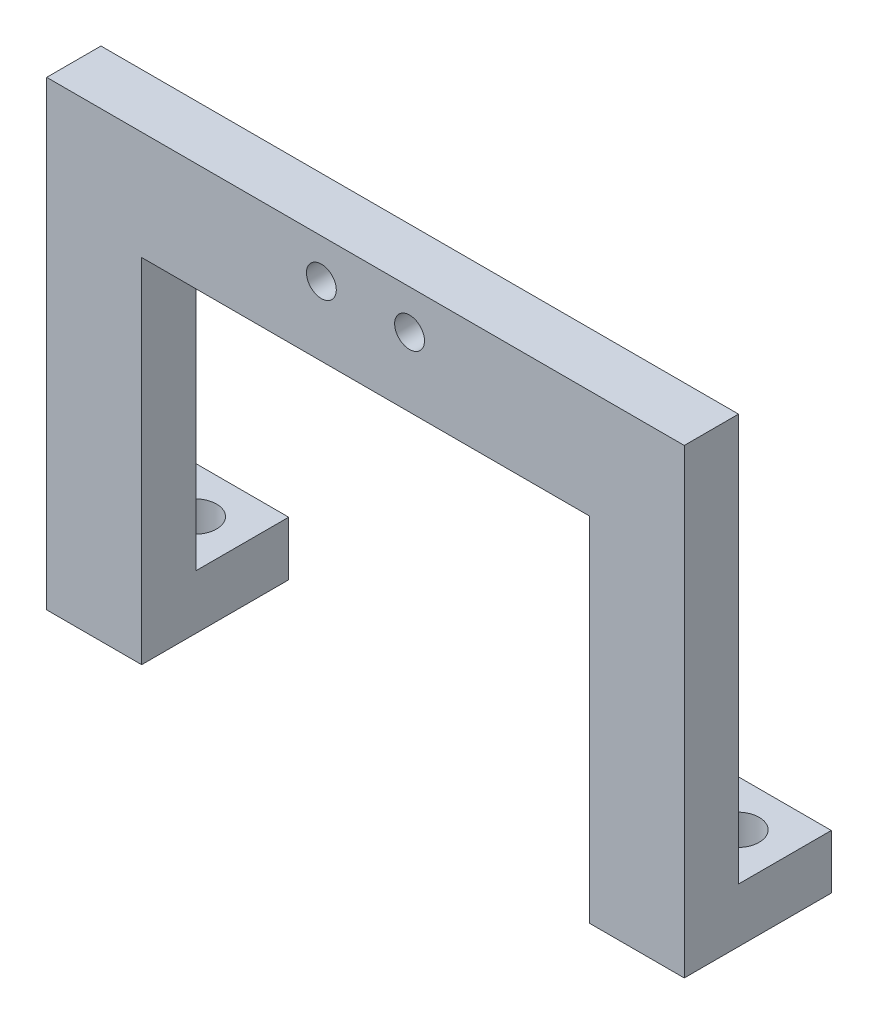
ISO-10303-21;
HEADER;
FILE_DESCRIPTION(('STEP AP214'),'2;1');
FILE_NAME('part.step','',(''),(''),'','','');
FILE_SCHEMA(('AUTOMOTIVE_DESIGN { 1 0 10303 214 1 1 1 1 }'));
ENDSEC;
DATA;
#1=APPLICATION_CONTEXT('core data for automotive mechanical design processes');
#2=APPLICATION_PROTOCOL_DEFINITION('international standard','automotive_design',2000,#1);
#3=PRODUCT_CONTEXT('',#1,'mechanical');
#4=PRODUCT('Part','Part','',(#3));
#5=PRODUCT_RELATED_PRODUCT_CATEGORY('part','',(#4));
#6=PRODUCT_DEFINITION_FORMATION('','',#4);
#7=PRODUCT_DEFINITION_CONTEXT('part definition',#1,'design');
#8=PRODUCT_DEFINITION('design','',#6,#7);
#9=PRODUCT_DEFINITION_SHAPE('','',#8);
#10=(LENGTH_UNIT() NAMED_UNIT(*) SI_UNIT(.MILLI.,.METRE.));
#11=(NAMED_UNIT(*) PLANE_ANGLE_UNIT() SI_UNIT($,.RADIAN.));
#12=(NAMED_UNIT(*) SI_UNIT($,.STERADIAN.) SOLID_ANGLE_UNIT());
#13=UNCERTAINTY_MEASURE_WITH_UNIT(LENGTH_MEASURE(1.E-05),#10,'distance_accuracy_value','');
#14=(GEOMETRIC_REPRESENTATION_CONTEXT(3) GLOBAL_UNCERTAINTY_ASSIGNED_CONTEXT((#13)) GLOBAL_UNIT_ASSIGNED_CONTEXT((#10,
#11,#12)) REPRESENTATION_CONTEXT('',''));
#15=CARTESIAN_POINT('',(0.,0.,0.));
#16=DIRECTION('',(0.,0.,1.));
#17=DIRECTION('',(1.,0.,0.));
#18=AXIS2_PLACEMENT_3D('',#15,#16,#17);
#19=CARTESIAN_POINT('',(23.5,26.,7.41991341991342));
#20=DIRECTION('',(0.,-1.,0.));
#21=DIRECTION('',(0.,0.,-1.));
#22=AXIS2_PLACEMENT_3D('',#19,#20,#21);
#23=PLANE('',#22);
#24=DIRECTION('',(-1.,0.,0.));
#25=VECTOR('',#24,1.);
#26=CARTESIAN_POINT('',(23.5,26.,3.41991341991342));
#27=LINE('',#26,#25);
#28=CARTESIAN_POINT('',(16.5,26.,3.41991341991342));
#29=VERTEX_POINT('',#28);
#30=CARTESIAN_POINT('',(-16.5,26.,3.41991341991342));
#31=VERTEX_POINT('',#30);
#32=EDGE_CURVE('E60',#29,#31,#27,.T.);
#33=ORIENTED_EDGE('',*,*,#32,.F.);
#34=DIRECTION('',(0.,0.,1.));
#35=VECTOR('',#34,1.);
#36=CARTESIAN_POINT('',(16.5,26.,7.41991341991342));
#37=LINE('',#36,#35);
#38=CARTESIAN_POINT('',(16.5,26.,7.41991341991342));
#39=VERTEX_POINT('',#38);
#40=EDGE_CURVE('E11',#29,#39,#37,.T.);
#41=ORIENTED_EDGE('',*,*,#40,.T.);
#42=DIRECTION('',(-1.,0.,0.));
#43=VECTOR('',#42,1.);
#44=CARTESIAN_POINT('',(23.5,26.,7.41991341991342));
#45=LINE('',#44,#43);
#46=CARTESIAN_POINT('',(-16.5,26.,7.41991341991342));
#47=VERTEX_POINT('',#46);
#48=EDGE_CURVE('E199',#39,#47,#45,.T.);
#49=ORIENTED_EDGE('',*,*,#48,.T.);
#50=DIRECTION('',(0.,0.,1.));
#51=VECTOR('',#50,1.);
#52=CARTESIAN_POINT('',(-16.5,26.,3.41991341991342));
#53=LINE('',#52,#51);
#54=EDGE_CURVE('E210',#31,#47,#53,.T.);
#55=ORIENTED_EDGE('',*,*,#54,.F.);
#56=EDGE_LOOP('',(#33,#41,#49,#55));
#57=FACE_BOUND('',#56,.T.);
#58=ADVANCED_FACE('F39',(#57),#23,.T.);
#59=CARTESIAN_POINT('',(0.,4.,0.));
#60=DIRECTION('',(0.,-1.,0.));
#61=DIRECTION('',(0.,0.,-1.));
#62=AXIS2_PLACEMENT_3D('',#59,#60,#61);
#63=PLANE('',#62);
#64=CARTESIAN_POINT('',(-20.,4.,0.));
#65=DIRECTION('',(0.,1.,0.));
#66=DIRECTION('',(0.,0.,1.));
#67=AXIS2_PLACEMENT_3D('',#64,#65,#66);
#68=CIRCLE('',#67,1.6);
#69=CARTESIAN_POINT('',(-20.,4.,1.6));
#70=VERTEX_POINT('',#69);
#71=EDGE_CURVE('E235',#70,#70,#68,.T.);
#72=ORIENTED_EDGE('',*,*,#71,.F.);
#73=EDGE_LOOP('',(#72));
#74=FACE_BOUND('',#73,.T.);
#75=DIRECTION('',(-1.,0.,0.));
#76=VECTOR('',#75,1.);
#77=CARTESIAN_POINT('',(-23.5,4.,3.41991341991342));
#78=LINE('',#77,#76);
#79=CARTESIAN_POINT('',(-16.5,4.,3.41991341991342));
#80=VERTEX_POINT('',#79);
#81=CARTESIAN_POINT('',(-23.5,4.,3.41991341991342));
#82=VERTEX_POINT('',#81);
#83=EDGE_CURVE('E214',#80,#82,#78,.T.);
#84=ORIENTED_EDGE('',*,*,#83,.F.);
#85=DIRECTION('',(0.,0.,-1.));
#86=VECTOR('',#85,1.);
#87=CARTESIAN_POINT('',(-16.5,4.,-3.41991341991342));
#88=LINE('',#87,#86);
#89=CARTESIAN_POINT('',(-16.5,4.,-3.41991341991342));
#90=VERTEX_POINT('',#89);
#91=EDGE_CURVE('E243',#80,#90,#88,.T.);
#92=ORIENTED_EDGE('',*,*,#91,.T.);
#93=DIRECTION('',(-1.,0.,0.));
#94=VECTOR('',#93,1.);
#95=CARTESIAN_POINT('',(-23.5,4.,-3.41991341991342));
#96=LINE('',#95,#94);
#97=CARTESIAN_POINT('',(-23.5,4.,-3.41991341991342));
#98=VERTEX_POINT('',#97);
#99=EDGE_CURVE('E246',#90,#98,#96,.T.);
#100=ORIENTED_EDGE('',*,*,#99,.T.);
#101=DIRECTION('',(0.,0.,1.));
#102=VECTOR('',#101,1.);
#103=CARTESIAN_POINT('',(-23.5,4.,3.41991341991342));
#104=LINE('',#103,#102);
#105=EDGE_CURVE('E250',#98,#82,#104,.T.);
#106=ORIENTED_EDGE('',*,*,#105,.T.);
#107=EDGE_LOOP('',(#84,#92,#100,#106));
#108=FACE_BOUND('',#107,.T.);
#109=ADVANCED_FACE('F301',(#74,#108),#63,.F.);
#110=CARTESIAN_POINT('',(0.,0.,0.));
#111=DIRECTION('',(0.,-1.,0.));
#112=DIRECTION('',(0.,0.,-1.));
#113=AXIS2_PLACEMENT_3D('',#110,#111,#112);
#114=PLANE('',#113);
#115=DIRECTION('',(-1.,0.,0.));
#116=VECTOR('',#115,1.);
#117=CARTESIAN_POINT('',(-23.5,0.,-3.41991341991342));
#118=LINE('',#117,#116);
#119=CARTESIAN_POINT('',(-16.5,0.,-3.41991341991342));
#120=VERTEX_POINT('',#119);
#121=CARTESIAN_POINT('',(-23.5,0.,-3.41991341991342));
#122=VERTEX_POINT('',#121);
#123=EDGE_CURVE('E239',#120,#122,#118,.T.);
#124=ORIENTED_EDGE('',*,*,#123,.F.);
#125=DIRECTION('',(0.,0.,-1.));
#126=VECTOR('',#125,1.);
#127=CARTESIAN_POINT('',(-16.5,0.,3.41991341991342));
#128=LINE('',#127,#126);
#129=CARTESIAN_POINT('',(-16.5,0.,7.41991341991342));
#130=VERTEX_POINT('',#129);
#131=EDGE_CURVE('E247',#130,#120,#128,.T.);
#132=ORIENTED_EDGE('',*,*,#131,.F.);
#133=DIRECTION('',(1.,0.,0.));
#134=VECTOR('',#133,1.);
#135=CARTESIAN_POINT('',(-16.5,0.,7.41991341991342));
#136=LINE('',#135,#134);
#137=CARTESIAN_POINT('',(-23.5,0.,7.41991341991342));
#138=VERTEX_POINT('',#137);
#139=EDGE_CURVE('E262',#138,#130,#136,.T.);
#140=ORIENTED_EDGE('',*,*,#139,.F.);
#141=DIRECTION('',(0.,0.,1.));
#142=VECTOR('',#141,1.);
#143=CARTESIAN_POINT('',(-23.5,0.,7.41991341991342));
#144=LINE('',#143,#142);
#145=EDGE_CURVE('E258',#122,#138,#144,.T.);
#146=ORIENTED_EDGE('',*,*,#145,.F.);
#147=EDGE_LOOP('',(#124,#132,#140,#146));
#148=FACE_BOUND('',#147,.T.);
#149=CARTESIAN_POINT('',(-20.,0.,0.));
#150=DIRECTION('',(0.,1.,0.));
#151=DIRECTION('',(0.,0.,1.));
#152=AXIS2_PLACEMENT_3D('',#149,#150,#151);
#153=CIRCLE('',#152,1.6);
#154=CARTESIAN_POINT('',(-20.,0.,1.6));
#155=VERTEX_POINT('',#154);
#156=EDGE_CURVE('E234',#155,#155,#153,.T.);
#157=ORIENTED_EDGE('',*,*,#156,.T.);
#158=EDGE_LOOP('',(#157));
#159=FACE_BOUND('',#158,.T.);
#160=ADVANCED_FACE('F291',(#148,#159),#114,.T.);
#161=CARTESIAN_POINT('',(-23.5,4.,-3.41991341991342));
#162=DIRECTION('',(0.,0.,1.));
#163=DIRECTION('',(1.,0.,0.));
#164=AXIS2_PLACEMENT_3D('',#161,#162,#163);
#165=PLANE('',#164);
#166=ORIENTED_EDGE('',*,*,#123,.T.);
#167=DIRECTION('',(0.,-1.,0.));
#168=VECTOR('',#167,1.);
#169=CARTESIAN_POINT('',(-23.5,4.,-3.41991341991342));
#170=LINE('',#169,#168);
#171=EDGE_CURVE('E273',#98,#122,#170,.T.);
#172=ORIENTED_EDGE('',*,*,#171,.F.);
#173=ORIENTED_EDGE('',*,*,#99,.F.);
#174=DIRECTION('',(0.,-1.,0.));
#175=VECTOR('',#174,1.);
#176=CARTESIAN_POINT('',(-16.5,4.,-3.41991341991342));
#177=LINE('',#176,#175);
#178=EDGE_CURVE('E48',#90,#120,#177,.T.);
#179=ORIENTED_EDGE('',*,*,#178,.T.);
#180=EDGE_LOOP('',(#166,#172,#173,#179));
#181=FACE_BOUND('',#180,.T.);
#182=ADVANCED_FACE('F41',(#181),#165,.F.);
#183=CARTESIAN_POINT('',(-23.5,4.,7.41991341991342));
#184=DIRECTION('',(1.,0.,0.));
#185=DIRECTION('',(0.,0.,-1.));
#186=AXIS2_PLACEMENT_3D('',#183,#184,#185);
#187=PLANE('',#186);
#188=ORIENTED_EDGE('',*,*,#145,.T.);
#189=DIRECTION('',(0.,-1.,0.));
#190=VECTOR('',#189,1.);
#191=CARTESIAN_POINT('',(-23.5,4.,7.41991341991342));
#192=LINE('',#191,#190);
#193=CARTESIAN_POINT('',(-23.5,34.,7.41991341991342));
#194=VERTEX_POINT('',#193);
#195=EDGE_CURVE('E270',#194,#138,#192,.T.);
#196=ORIENTED_EDGE('',*,*,#195,.F.);
#197=DIRECTION('',(0.,0.,1.));
#198=VECTOR('',#197,1.);
#199=CARTESIAN_POINT('',(-23.5,34.,3.41991341991342));
#200=LINE('',#199,#198);
#201=CARTESIAN_POINT('',(-23.5,34.,3.41991341991342));
#202=VERTEX_POINT('',#201);
#203=EDGE_CURVE('E215',#202,#194,#200,.T.);
#204=ORIENTED_EDGE('',*,*,#203,.F.);
#205=DIRECTION('',(0.,-1.,0.));
#206=VECTOR('',#205,1.);
#207=CARTESIAN_POINT('',(-23.5,34.,3.41991341991342));
#208=LINE('',#207,#206);
#209=EDGE_CURVE('E225',#202,#82,#208,.T.);
#210=ORIENTED_EDGE('',*,*,#209,.T.);
#211=ORIENTED_EDGE('',*,*,#105,.F.);
#212=ORIENTED_EDGE('',*,*,#171,.T.);
#213=EDGE_LOOP('',(#188,#196,#204,#210,#211,#212));
#214=FACE_BOUND('',#213,.T.);
#215=ADVANCED_FACE('F294',(#214),#187,.F.);
#216=CARTESIAN_POINT('',(-16.5,4.,7.41991341991342));
#217=DIRECTION('',(0.,0.,-1.));
#218=DIRECTION('',(-1.,0.,0.));
#219=AXIS2_PLACEMENT_3D('',#216,#217,#218);
#220=PLANE('',#219);
#221=CARTESIAN_POINT('',(3.25,31.1,7.41991341991342));
#222=DIRECTION('',(0.,0.,-1.));
#223=DIRECTION('',(-1.,0.,0.));
#224=AXIS2_PLACEMENT_3D('',#221,#222,#223);
#225=CIRCLE('',#224,1.1);
#226=CARTESIAN_POINT('',(2.15,31.1,7.41991341991342));
#227=VERTEX_POINT('',#226);
#228=EDGE_CURVE('E150',#227,#227,#225,.T.);
#229=ORIENTED_EDGE('',*,*,#228,.T.);
#230=EDGE_LOOP('',(#229));
#231=FACE_BOUND('',#230,.T.);
#232=CARTESIAN_POINT('',(-3.25,31.1,7.41991341991342));
#233=DIRECTION('',(0.,0.,-1.));
#234=DIRECTION('',(1.,0.,0.));
#235=AXIS2_PLACEMENT_3D('',#232,#233,#234);
#236=CIRCLE('',#235,1.1);
#237=CARTESIAN_POINT('',(-2.15,31.1,7.41991341991342));
#238=VERTEX_POINT('',#237);
#239=EDGE_CURVE('E484',#238,#238,#236,.T.);
#240=ORIENTED_EDGE('',*,*,#239,.T.);
#241=EDGE_LOOP('',(#240));
#242=FACE_BOUND('',#241,.T.);
#243=DIRECTION('',(0.,-1.,0.));
#244=VECTOR('',#243,1.);
#245=CARTESIAN_POINT('',(23.5,34.,7.41991341991342));
#246=LINE('',#245,#244);
#247=CARTESIAN_POINT('',(23.5,34.,7.41991341991342));
#248=VERTEX_POINT('',#247);
#249=CARTESIAN_POINT('',(23.5,0.,7.41991341991342));
#250=VERTEX_POINT('',#249);
#251=EDGE_CURVE('E196',#248,#250,#246,.T.);
#252=ORIENTED_EDGE('',*,*,#251,.F.);
#253=DIRECTION('',(1.,0.,0.));
#254=VECTOR('',#253,1.);
#255=CARTESIAN_POINT('',(-23.5,34.,7.41991341991342));
#256=LINE('',#255,#254);
#257=EDGE_CURVE('E219',#194,#248,#256,.T.);
#258=ORIENTED_EDGE('',*,*,#257,.F.);
#259=ORIENTED_EDGE('',*,*,#195,.T.);
#260=ORIENTED_EDGE('',*,*,#139,.T.);
#261=DIRECTION('',(0.,-1.,0.));
#262=VECTOR('',#261,1.);
#263=CARTESIAN_POINT('',(-16.5,4.,7.41991341991342));
#264=LINE('',#263,#262);
#265=EDGE_CURVE('E254',#47,#130,#264,.T.);
#266=ORIENTED_EDGE('',*,*,#265,.F.);
#267=ORIENTED_EDGE('',*,*,#48,.F.);
#268=DIRECTION('',(0.,-1.,0.));
#269=VECTOR('',#268,1.);
#270=CARTESIAN_POINT('',(16.5,4.,7.41991341991342));
#271=LINE('',#270,#269);
#272=CARTESIAN_POINT('',(16.5,0.,7.41991341991342));
#273=VERTEX_POINT('',#272);
#274=EDGE_CURVE('E144',#39,#273,#271,.T.);
#275=ORIENTED_EDGE('',*,*,#274,.T.);
#276=DIRECTION('',(1.,0.,0.));
#277=VECTOR('',#276,1.);
#278=CARTESIAN_POINT('',(16.5,0.,7.41991341991342));
#279=LINE('',#278,#277);
#280=EDGE_CURVE('E164',#273,#250,#279,.T.);
#281=ORIENTED_EDGE('',*,*,#280,.T.);
#282=EDGE_LOOP('',(#252,#258,#259,#260,#266,#267,#275,#281));
#283=FACE_BOUND('',#282,.T.);
#284=ADVANCED_FACE('F306',(#231,#242,#283),#220,.F.);
#285=CARTESIAN_POINT('',(-16.5,4.,3.41991341991342));
#286=DIRECTION('',(-1.,0.,0.));
#287=DIRECTION('',(0.,0.,1.));
#288=AXIS2_PLACEMENT_3D('',#285,#286,#287);
#289=PLANE('',#288);
#290=DIRECTION('',(0.,-1.,0.));
#291=VECTOR('',#290,1.);
#292=CARTESIAN_POINT('',(-16.5,34.,3.41991341991342));
#293=LINE('',#292,#291);
#294=EDGE_CURVE('E231',#31,#80,#293,.T.);
#295=ORIENTED_EDGE('',*,*,#294,.F.);
#296=ORIENTED_EDGE('',*,*,#54,.T.);
#297=ORIENTED_EDGE('',*,*,#265,.T.);
#298=ORIENTED_EDGE('',*,*,#131,.T.);
#299=ORIENTED_EDGE('',*,*,#178,.F.);
#300=ORIENTED_EDGE('',*,*,#91,.F.);
#301=EDGE_LOOP('',(#295,#296,#297,#298,#299,#300));
#302=FACE_BOUND('',#301,.T.);
#303=ADVANCED_FACE('F286',(#302),#289,.F.);
#304=CARTESIAN_POINT('',(-20.,4.,0.));
#305=DIRECTION('',(0.,-1.,0.));
#306=DIRECTION('',(0.,0.,-1.));
#307=AXIS2_PLACEMENT_3D('',#304,#305,#306);
#308=CYLINDRICAL_SURFACE('',#307,1.6);
#309=ORIENTED_EDGE('',*,*,#71,.T.);
#310=EDGE_LOOP('',(#309));
#311=FACE_BOUND('',#310,.T.);
#312=ORIENTED_EDGE('',*,*,#156,.F.);
#313=EDGE_LOOP('',(#312));
#314=FACE_BOUND('',#313,.T.);
#315=ADVANCED_FACE('F354',(#311,#314),#308,.F.);
#316=CARTESIAN_POINT('',(-23.5,34.,3.41991341991342));
#317=DIRECTION('',(0.,0.,1.));
#318=DIRECTION('',(1.,0.,0.));
#319=AXIS2_PLACEMENT_3D('',#316,#317,#318);
#320=PLANE('',#319);
#321=CARTESIAN_POINT('',(3.25,31.1,3.41991341991342));
#322=DIRECTION('',(0.,0.,-1.));
#323=DIRECTION('',(-1.,0.,0.));
#324=AXIS2_PLACEMENT_3D('',#321,#322,#323);
#325=CIRCLE('',#324,1.1);
#326=CARTESIAN_POINT('',(2.15,31.1,3.41991341991342));
#327=VERTEX_POINT('',#326);
#328=EDGE_CURVE('E154',#327,#327,#325,.T.);
#329=ORIENTED_EDGE('',*,*,#328,.F.);
#330=EDGE_LOOP('',(#329));
#331=FACE_BOUND('',#330,.T.);
#332=CARTESIAN_POINT('',(-3.25,31.1,3.41991341991342));
#333=DIRECTION('',(0.,0.,-1.));
#334=DIRECTION('',(1.,0.,0.));
#335=AXIS2_PLACEMENT_3D('',#332,#333,#334);
#336=CIRCLE('',#335,1.1);
#337=CARTESIAN_POINT('',(-2.15,31.1,3.41991341991342));
#338=VERTEX_POINT('',#337);
#339=EDGE_CURVE('E157',#338,#338,#336,.T.);
#340=ORIENTED_EDGE('',*,*,#339,.F.);
#341=EDGE_LOOP('',(#340));
#342=FACE_BOUND('',#341,.T.);
#343=DIRECTION('',(0.,-1.,0.));
#344=VECTOR('',#343,1.);
#345=CARTESIAN_POINT('',(23.5,34.,3.41991341991342));
#346=LINE('',#345,#344);
#347=CARTESIAN_POINT('',(23.5,34.,3.41991341991342));
#348=VERTEX_POINT('',#347);
#349=CARTESIAN_POINT('',(23.5,4.,3.41991341991342));
#350=VERTEX_POINT('',#349);
#351=EDGE_CURVE('E148',#348,#350,#346,.T.);
#352=ORIENTED_EDGE('',*,*,#351,.T.);
#353=DIRECTION('',(-1.,0.,0.));
#354=VECTOR('',#353,1.);
#355=CARTESIAN_POINT('',(16.5,4.,3.41991341991342));
#356=LINE('',#355,#354);
#357=CARTESIAN_POINT('',(16.5,4.,3.41991341991342));
#358=VERTEX_POINT('',#357);
#359=EDGE_CURVE('E133',#350,#358,#356,.T.);
#360=ORIENTED_EDGE('',*,*,#359,.T.);
#361=DIRECTION('',(0.,-1.,0.));
#362=VECTOR('',#361,1.);
#363=CARTESIAN_POINT('',(16.5,34.,3.41991341991342));
#364=LINE('',#363,#362);
#365=EDGE_CURVE('E55',#29,#358,#364,.T.);
#366=ORIENTED_EDGE('',*,*,#365,.F.);
#367=ORIENTED_EDGE('',*,*,#32,.T.);
#368=ORIENTED_EDGE('',*,*,#294,.T.);
#369=ORIENTED_EDGE('',*,*,#83,.T.);
#370=ORIENTED_EDGE('',*,*,#209,.F.);
#371=DIRECTION('',(-1.,0.,0.));
#372=VECTOR('',#371,1.);
#373=CARTESIAN_POINT('',(-23.5,34.,3.41991341991342));
#374=LINE('',#373,#372);
#375=EDGE_CURVE('E222',#348,#202,#374,.T.);
#376=ORIENTED_EDGE('',*,*,#375,.F.);
#377=EDGE_LOOP('',(#352,#360,#366,#367,#368,#369,#370,#376));
#378=FACE_BOUND('',#377,.T.);
#379=ADVANCED_FACE('F146',(#331,#342,#378),#320,.F.);
#380=CARTESIAN_POINT('',(0.,34.,0.));
#381=DIRECTION('',(0.,1.,0.));
#382=DIRECTION('',(0.,0.,1.));
#383=AXIS2_PLACEMENT_3D('',#380,#381,#382);
#384=PLANE('',#383);
#385=ORIENTED_EDGE('',*,*,#375,.T.);
#386=ORIENTED_EDGE('',*,*,#203,.T.);
#387=ORIENTED_EDGE('',*,*,#257,.T.);
#388=DIRECTION('',(0.,0.,-1.));
#389=VECTOR('',#388,1.);
#390=CARTESIAN_POINT('',(23.5,34.,7.41991341991342));
#391=LINE('',#390,#389);
#392=EDGE_CURVE('E202',#248,#348,#391,.T.);
#393=ORIENTED_EDGE('',*,*,#392,.T.);
#394=EDGE_LOOP('',(#385,#386,#387,#393));
#395=FACE_BOUND('',#394,.T.);
#396=ADVANCED_FACE('F309',(#395),#384,.T.);
#397=CARTESIAN_POINT('',(23.5,34.,7.41991341991342));
#398=DIRECTION('',(1.,0.,0.));
#399=DIRECTION('',(0.,0.,-1.));
#400=AXIS2_PLACEMENT_3D('',#397,#398,#399);
#401=PLANE('',#400);
#402=ORIENTED_EDGE('',*,*,#351,.F.);
#403=ORIENTED_EDGE('',*,*,#392,.F.);
#404=ORIENTED_EDGE('',*,*,#251,.T.);
#405=DIRECTION('',(0.,0.,-1.));
#406=VECTOR('',#405,1.);
#407=CARTESIAN_POINT('',(23.5,0.,3.41991341991342));
#408=LINE('',#407,#406);
#409=CARTESIAN_POINT('',(23.5,0.,-3.41991341991342));
#410=VERTEX_POINT('',#409);
#411=EDGE_CURVE('E177',#250,#410,#408,.T.);
#412=ORIENTED_EDGE('',*,*,#411,.T.);
#413=DIRECTION('',(0.,-1.,0.));
#414=VECTOR('',#413,1.);
#415=CARTESIAN_POINT('',(23.5,4.,-3.41991341991342));
#416=LINE('',#415,#414);
#417=CARTESIAN_POINT('',(23.5,4.,-3.41991341991342));
#418=VERTEX_POINT('',#417);
#419=EDGE_CURVE('E192',#418,#410,#416,.T.);
#420=ORIENTED_EDGE('',*,*,#419,.F.);
#421=DIRECTION('',(0.,0.,-1.));
#422=VECTOR('',#421,1.);
#423=CARTESIAN_POINT('',(23.5,4.,7.41991341991342));
#424=LINE('',#423,#422);
#425=EDGE_CURVE('E168',#350,#418,#424,.T.);
#426=ORIENTED_EDGE('',*,*,#425,.F.);
#427=EDGE_LOOP('',(#402,#403,#404,#412,#420,#426));
#428=FACE_BOUND('',#427,.T.);
#429=ADVANCED_FACE('F311',(#428),#401,.T.);
#430=CARTESIAN_POINT('',(0.,4.,0.));
#431=DIRECTION('',(0.,1.,0.));
#432=DIRECTION('',(0.,0.,1.));
#433=AXIS2_PLACEMENT_3D('',#430,#431,#432);
#434=PLANE('',#433);
#435=ORIENTED_EDGE('',*,*,#359,.F.);
#436=ORIENTED_EDGE('',*,*,#425,.T.);
#437=DIRECTION('',(-1.,0.,0.));
#438=VECTOR('',#437,1.);
#439=CARTESIAN_POINT('',(23.5,4.,-3.41991341991342));
#440=LINE('',#439,#438);
#441=CARTESIAN_POINT('',(16.5,4.,-3.41991341991342));
#442=VERTEX_POINT('',#441);
#443=EDGE_CURVE('E141',#418,#442,#440,.T.);
#444=ORIENTED_EDGE('',*,*,#443,.T.);
#445=DIRECTION('',(0.,0.,1.));
#446=VECTOR('',#445,1.);
#447=CARTESIAN_POINT('',(16.5,4.,-3.41991341991342));
#448=LINE('',#447,#446);
#449=EDGE_CURVE('E130',#442,#358,#448,.T.);
#450=ORIENTED_EDGE('',*,*,#449,.T.);
#451=EDGE_LOOP('',(#435,#436,#444,#450));
#452=FACE_BOUND('',#451,.T.);
#453=CARTESIAN_POINT('',(20.,4.,0.));
#454=DIRECTION('',(0.,1.,0.));
#455=DIRECTION('',(0.,0.,-1.));
#456=AXIS2_PLACEMENT_3D('',#453,#454,#455);
#457=CIRCLE('',#456,1.6);
#458=CARTESIAN_POINT('',(20.,4.,-1.6));
#459=VERTEX_POINT('',#458);
#460=EDGE_CURVE('E160',#459,#459,#457,.T.);
#461=ORIENTED_EDGE('',*,*,#460,.F.);
#462=EDGE_LOOP('',(#461));
#463=FACE_BOUND('',#462,.T.);
#464=ADVANCED_FACE('F137',(#452,#463),#434,.T.);
#465=CARTESIAN_POINT('',(0.,0.,0.));
#466=DIRECTION('',(0.,1.,0.));
#467=DIRECTION('',(0.,0.,1.));
#468=AXIS2_PLACEMENT_3D('',#465,#466,#467);
#469=PLANE('',#468);
#470=ORIENTED_EDGE('',*,*,#280,.F.);
#471=DIRECTION('',(0.,0.,1.));
#472=VECTOR('',#471,1.);
#473=CARTESIAN_POINT('',(16.5,0.,3.41991341991342));
#474=LINE('',#473,#472);
#475=CARTESIAN_POINT('',(16.5,0.,-3.41991341991342));
#476=VERTEX_POINT('',#475);
#477=EDGE_CURVE('E171',#476,#273,#474,.T.);
#478=ORIENTED_EDGE('',*,*,#477,.F.);
#479=DIRECTION('',(-1.,0.,0.));
#480=VECTOR('',#479,1.);
#481=CARTESIAN_POINT('',(23.5,0.,-3.41991341991342));
#482=LINE('',#481,#480);
#483=EDGE_CURVE('E180',#410,#476,#482,.T.);
#484=ORIENTED_EDGE('',*,*,#483,.F.);
#485=ORIENTED_EDGE('',*,*,#411,.F.);
#486=EDGE_LOOP('',(#470,#478,#484,#485));
#487=FACE_BOUND('',#486,.T.);
#488=CARTESIAN_POINT('',(20.,0.,0.));
#489=DIRECTION('',(0.,1.,0.));
#490=DIRECTION('',(0.,0.,-1.));
#491=AXIS2_PLACEMENT_3D('',#488,#489,#490);
#492=CIRCLE('',#491,1.6);
#493=CARTESIAN_POINT('',(20.,0.,-1.6));
#494=VERTEX_POINT('',#493);
#495=EDGE_CURVE('E132',#494,#494,#492,.T.);
#496=ORIENTED_EDGE('',*,*,#495,.T.);
#497=EDGE_LOOP('',(#496));
#498=FACE_BOUND('',#497,.T.);
#499=ADVANCED_FACE('F319',(#487,#498),#469,.F.);
#500=CARTESIAN_POINT('',(23.5,4.,-3.41991341991342));
#501=DIRECTION('',(0.,0.,1.));
#502=DIRECTION('',(1.,0.,0.));
#503=AXIS2_PLACEMENT_3D('',#500,#501,#502);
#504=PLANE('',#503);
#505=ORIENTED_EDGE('',*,*,#483,.T.);
#506=DIRECTION('',(0.,-1.,0.));
#507=VECTOR('',#506,1.);
#508=CARTESIAN_POINT('',(16.5,4.,-3.41991341991342));
#509=LINE('',#508,#507);
#510=EDGE_CURVE('E189',#442,#476,#509,.T.);
#511=ORIENTED_EDGE('',*,*,#510,.F.);
#512=ORIENTED_EDGE('',*,*,#443,.F.);
#513=ORIENTED_EDGE('',*,*,#419,.T.);
#514=EDGE_LOOP('',(#505,#511,#512,#513));
#515=FACE_BOUND('',#514,.T.);
#516=ADVANCED_FACE('F316',(#515),#504,.F.);
#517=CARTESIAN_POINT('',(16.5,4.,3.41991341991342));
#518=DIRECTION('',(1.,0.,0.));
#519=DIRECTION('',(0.,0.,-1.));
#520=AXIS2_PLACEMENT_3D('',#517,#518,#519);
#521=PLANE('',#520);
#522=ORIENTED_EDGE('',*,*,#40,.F.);
#523=ORIENTED_EDGE('',*,*,#365,.T.);
#524=ORIENTED_EDGE('',*,*,#449,.F.);
#525=ORIENTED_EDGE('',*,*,#510,.T.);
#526=ORIENTED_EDGE('',*,*,#477,.T.);
#527=ORIENTED_EDGE('',*,*,#274,.F.);
#528=EDGE_LOOP('',(#522,#523,#524,#525,#526,#527));
#529=FACE_BOUND('',#528,.T.);
#530=ADVANCED_FACE('F128',(#529),#521,.F.);
#531=CARTESIAN_POINT('',(20.,4.,0.));
#532=DIRECTION('',(0.,-1.,0.));
#533=DIRECTION('',(0.,0.,-1.));
#534=AXIS2_PLACEMENT_3D('',#531,#532,#533);
#535=CYLINDRICAL_SURFACE('',#534,1.6);
#536=ORIENTED_EDGE('',*,*,#460,.T.);
#537=EDGE_LOOP('',(#536));
#538=FACE_BOUND('',#537,.T.);
#539=ORIENTED_EDGE('',*,*,#495,.F.);
#540=EDGE_LOOP('',(#539));
#541=FACE_BOUND('',#540,.T.);
#542=ADVANCED_FACE('F325',(#538,#541),#535,.F.);
#543=CARTESIAN_POINT('',(-3.25,31.1,7.41991341991342));
#544=DIRECTION('',(0.,0.,-1.));
#545=DIRECTION('',(-1.,0.,0.));
#546=AXIS2_PLACEMENT_3D('',#543,#544,#545);
#547=CYLINDRICAL_SURFACE('',#546,1.1);
#548=ORIENTED_EDGE('',*,*,#239,.F.);
#549=EDGE_LOOP('',(#548));
#550=FACE_BOUND('',#549,.T.);
#551=ORIENTED_EDGE('',*,*,#339,.T.);
#552=EDGE_LOOP('',(#551));
#553=FACE_BOUND('',#552,.T.);
#554=ADVANCED_FACE('F327',(#550,#553),#547,.F.);
#555=CARTESIAN_POINT('',(3.25,31.1,7.41991341991342));
#556=DIRECTION('',(0.,0.,-1.));
#557=DIRECTION('',(-1.,0.,0.));
#558=AXIS2_PLACEMENT_3D('',#555,#556,#557);
#559=CYLINDRICAL_SURFACE('',#558,1.1);
#560=ORIENTED_EDGE('',*,*,#228,.F.);
#561=EDGE_LOOP('',(#560));
#562=FACE_BOUND('',#561,.T.);
#563=ORIENTED_EDGE('',*,*,#328,.T.);
#564=EDGE_LOOP('',(#563));
#565=FACE_BOUND('',#564,.T.);
#566=ADVANCED_FACE('F334',(#562,#565),#559,.F.);
#567=CLOSED_SHELL('',(#58,#109,#160,#182,#215,#284,#303,#315,#379,#396,#429,#464,#499,#516,#530,
#542,#554,#566));
#568=MANIFOLD_SOLID_BREP('B2',#567);
#569=ADVANCED_BREP_SHAPE_REPRESENTATION('',(#18,#568),#14);
#570=SHAPE_DEFINITION_REPRESENTATION(#9,#569);
ENDSEC;
END-ISO-10303-21;
